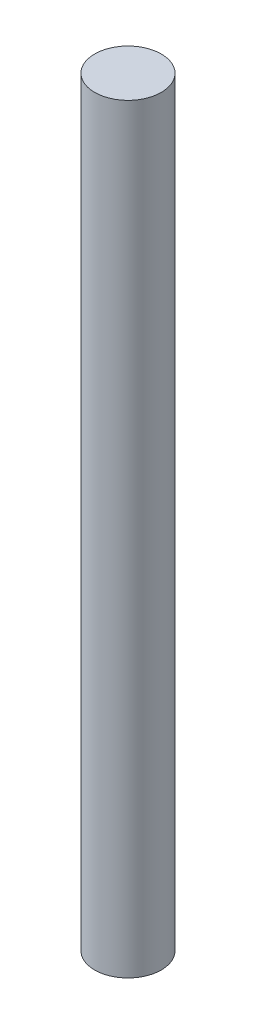
ISO-10303-21;
HEADER;
FILE_DESCRIPTION(('STEP AP214'),'2;1');
FILE_NAME('part.step','',(''),(''),'','','');
FILE_SCHEMA(('AUTOMOTIVE_DESIGN { 1 0 10303 214 1 1 1 1 }'));
ENDSEC;
DATA;
#1=APPLICATION_CONTEXT('core data for automotive mechanical design processes');
#2=APPLICATION_PROTOCOL_DEFINITION('international standard','automotive_design',2000,#1);
#3=PRODUCT_CONTEXT('',#1,'mechanical');
#4=PRODUCT('Part','Part','',(#3));
#5=PRODUCT_RELATED_PRODUCT_CATEGORY('part','',(#4));
#6=PRODUCT_DEFINITION_FORMATION('','',#4);
#7=PRODUCT_DEFINITION_CONTEXT('part definition',#1,'design');
#8=PRODUCT_DEFINITION('design','',#6,#7);
#9=PRODUCT_DEFINITION_SHAPE('','',#8);
#10=(LENGTH_UNIT() NAMED_UNIT(*) SI_UNIT(.MILLI.,.METRE.));
#11=(NAMED_UNIT(*) PLANE_ANGLE_UNIT() SI_UNIT($,.RADIAN.));
#12=(NAMED_UNIT(*) SI_UNIT($,.STERADIAN.) SOLID_ANGLE_UNIT());
#13=UNCERTAINTY_MEASURE_WITH_UNIT(LENGTH_MEASURE(1.E-05),#10,'distance_accuracy_value','');
#14=(GEOMETRIC_REPRESENTATION_CONTEXT(3) GLOBAL_UNCERTAINTY_ASSIGNED_CONTEXT((#13)) GLOBAL_UNIT_ASSIGNED_CONTEXT((#10,
#11,#12)) REPRESENTATION_CONTEXT('',''));
#15=CARTESIAN_POINT('',(0.,0.,0.));
#16=DIRECTION('',(0.,0.,1.));
#17=DIRECTION('',(1.,0.,0.));
#18=AXIS2_PLACEMENT_3D('',#15,#16,#17);
#19=CARTESIAN_POINT('',(0.,86.3,0.));
#20=DIRECTION('',(0.,-1.,0.));
#21=DIRECTION('',(0.,0.,-1.));
#22=AXIS2_PLACEMENT_3D('',#19,#20,#21);
#23=CYLINDRICAL_SURFACE('',#22,3.78);
#24=CARTESIAN_POINT('',(0.,86.3,0.));
#25=DIRECTION('',(0.,1.,0.));
#26=DIRECTION('',(0.,0.,1.));
#27=AXIS2_PLACEMENT_3D('',#24,#25,#26);
#28=CIRCLE('',#27,3.78);
#29=CARTESIAN_POINT('',(0.,86.3,3.78));
#30=VERTEX_POINT('',#29);
#31=EDGE_CURVE('E10',#30,#30,#28,.T.);
#32=ORIENTED_EDGE('',*,*,#31,.F.);
#33=EDGE_LOOP('',(#32));
#34=FACE_BOUND('',#33,.T.);
#35=CARTESIAN_POINT('',(0.,0.,0.));
#36=DIRECTION('',(0.,1.,0.));
#37=DIRECTION('',(0.,0.,1.));
#38=AXIS2_PLACEMENT_3D('',#35,#36,#37);
#39=CIRCLE('',#38,3.78);
#40=CARTESIAN_POINT('',(0.,0.,3.78));
#41=VERTEX_POINT('',#40);
#42=EDGE_CURVE('E35',#41,#41,#39,.T.);
#43=ORIENTED_EDGE('',*,*,#42,.T.);
#44=EDGE_LOOP('',(#43));
#45=FACE_BOUND('',#44,.T.);
#46=ADVANCED_FACE('F32',(#34,#45),#23,.T.);
#47=CARTESIAN_POINT('',(0.,86.3,0.));
#48=DIRECTION('',(0.,1.,0.));
#49=DIRECTION('',(0.,0.,1.));
#50=AXIS2_PLACEMENT_3D('',#47,#48,#49);
#51=PLANE('',#50);
#52=ORIENTED_EDGE('',*,*,#31,.T.);
#53=EDGE_LOOP('',(#52));
#54=FACE_BOUND('',#53,.T.);
#55=ADVANCED_FACE('F47',(#54),#51,.T.);
#56=CARTESIAN_POINT('',(0.,0.,0.));
#57=DIRECTION('',(0.,1.,0.));
#58=DIRECTION('',(0.,0.,1.));
#59=AXIS2_PLACEMENT_3D('',#56,#57,#58);
#60=PLANE('',#59);
#61=ORIENTED_EDGE('',*,*,#42,.F.);
#62=EDGE_LOOP('',(#61));
#63=FACE_BOUND('',#62,.T.);
#64=ADVANCED_FACE('F45',(#63),#60,.F.);
#65=CLOSED_SHELL('',(#46,#55,#64));
#66=MANIFOLD_SOLID_BREP('B2',#65);
#67=ADVANCED_BREP_SHAPE_REPRESENTATION('',(#18,#66),#14);
#68=SHAPE_DEFINITION_REPRESENTATION(#9,#67);
ENDSEC;
END-ISO-10303-21;
